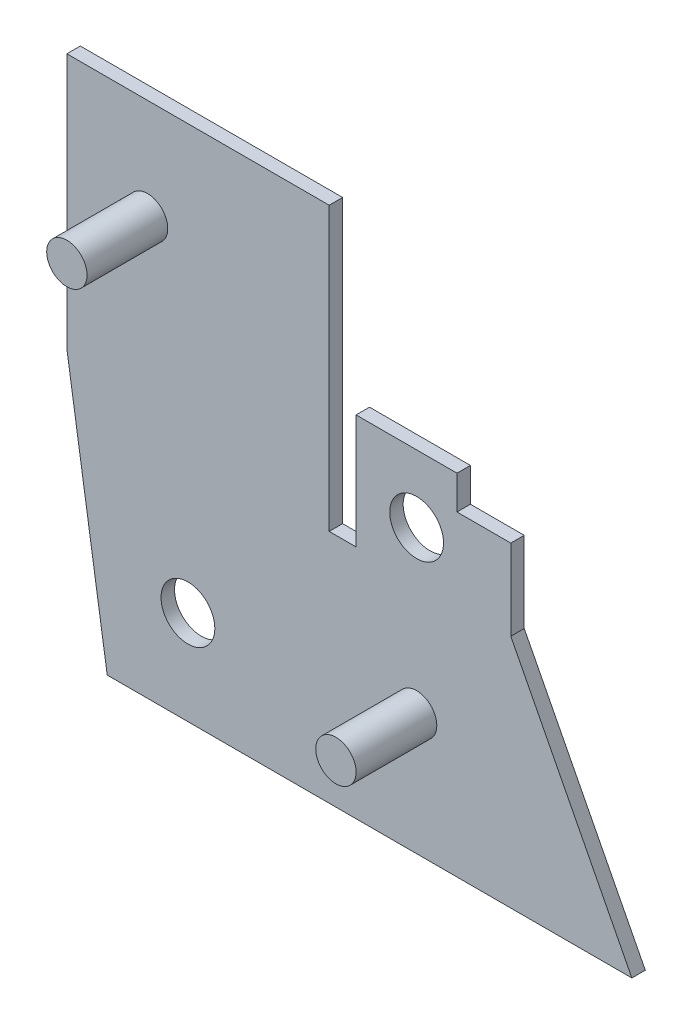
ISO-10303-21;
HEADER;
FILE_DESCRIPTION(('STEP AP214'),'2;1');
FILE_NAME('part.step','',(''),(''),'','','');
FILE_SCHEMA(('AUTOMOTIVE_DESIGN { 1 0 10303 214 1 1 1 1 }'));
ENDSEC;
DATA;
#1=APPLICATION_CONTEXT('core data for automotive mechanical design processes');
#2=APPLICATION_PROTOCOL_DEFINITION('international standard','automotive_design',2000,#1);
#3=PRODUCT_CONTEXT('',#1,'mechanical');
#4=PRODUCT('Part','Part','',(#3));
#5=PRODUCT_RELATED_PRODUCT_CATEGORY('part','',(#4));
#6=PRODUCT_DEFINITION_FORMATION('','',#4);
#7=PRODUCT_DEFINITION_CONTEXT('part definition',#1,'design');
#8=PRODUCT_DEFINITION('design','',#6,#7);
#9=PRODUCT_DEFINITION_SHAPE('','',#8);
#10=(LENGTH_UNIT() NAMED_UNIT(*) SI_UNIT(.MILLI.,.METRE.));
#11=(NAMED_UNIT(*) PLANE_ANGLE_UNIT() SI_UNIT($,.RADIAN.));
#12=(NAMED_UNIT(*) SI_UNIT($,.STERADIAN.) SOLID_ANGLE_UNIT());
#13=UNCERTAINTY_MEASURE_WITH_UNIT(LENGTH_MEASURE(1.E-05),#10,'distance_accuracy_value','');
#14=(GEOMETRIC_REPRESENTATION_CONTEXT(3) GLOBAL_UNCERTAINTY_ASSIGNED_CONTEXT((#13)) GLOBAL_UNIT_ASSIGNED_CONTEXT((#10,
#11,#12)) REPRESENTATION_CONTEXT('',''));
#15=CARTESIAN_POINT('',(0.,0.,0.));
#16=DIRECTION('',(0.,0.,1.));
#17=DIRECTION('',(1.,0.,0.));
#18=AXIS2_PLACEMENT_3D('',#15,#16,#17);
#19=CARTESIAN_POINT('',(30.,17.5,0.));
#20=DIRECTION('',(0.,1.,0.));
#21=DIRECTION('',(0.,0.,1.));
#22=AXIS2_PLACEMENT_3D('',#19,#20,#21);
#23=PLANE('',#22);
#24=DIRECTION('',(-1.,0.,0.));
#25=VECTOR('',#24,1.);
#26=CARTESIAN_POINT('',(30.,17.5,1.));
#27=LINE('',#26,#25);
#28=CARTESIAN_POINT('',(18.5,17.5,1.));
#29=VERTEX_POINT('',#28);
#30=CARTESIAN_POINT('',(16.5,17.5,1.));
#31=VERTEX_POINT('',#30);
#32=EDGE_CURVE('E186',#29,#31,#27,.T.);
#33=ORIENTED_EDGE('',*,*,#32,.F.);
#34=DIRECTION('',(0.,0.,1.));
#35=VECTOR('',#34,1.);
#36=CARTESIAN_POINT('',(18.5,17.5,1.));
#37=LINE('',#36,#35);
#38=CARTESIAN_POINT('',(18.5,17.5,0.));
#39=VERTEX_POINT('',#38);
#40=EDGE_CURVE('E157',#39,#29,#37,.T.);
#41=ORIENTED_EDGE('',*,*,#40,.F.);
#42=DIRECTION('',(-1.,0.,0.));
#43=VECTOR('',#42,1.);
#44=CARTESIAN_POINT('',(30.,17.5,0.));
#45=LINE('',#44,#43);
#46=CARTESIAN_POINT('',(16.5,17.5,0.));
#47=VERTEX_POINT('',#46);
#48=EDGE_CURVE('E169',#39,#47,#45,.T.);
#49=ORIENTED_EDGE('',*,*,#48,.T.);
#50=DIRECTION('',(0.,0.,1.));
#51=VECTOR('',#50,1.);
#52=CARTESIAN_POINT('',(16.5,17.5,0.));
#53=LINE('',#52,#51);
#54=EDGE_CURVE('E207',#47,#31,#53,.T.);
#55=ORIENTED_EDGE('',*,*,#54,.T.);
#56=EDGE_LOOP('',(#33,#41,#49,#55));
#57=FACE_BOUND('',#56,.T.);
#58=ADVANCED_FACE('F35',(#57),#23,.T.);
#59=CARTESIAN_POINT('',(0.,0.,0.));
#60=DIRECTION('',(0.,-1.,0.));
#61=DIRECTION('',(0.,0.,-1.));
#62=AXIS2_PLACEMENT_3D('',#59,#60,#61);
#63=PLANE('',#62);
#64=DIRECTION('',(1.,0.,0.));
#65=VECTOR('',#64,1.);
#66=CARTESIAN_POINT('',(0.,0.,1.));
#67=LINE('',#66,#65);
#68=CARTESIAN_POINT('',(0.,0.,1.));
#69=VERTEX_POINT('',#68);
#70=CARTESIAN_POINT('',(39.,0.,1.));
#71=VERTEX_POINT('',#70);
#72=EDGE_CURVE('E161',#69,#71,#67,.T.);
#73=ORIENTED_EDGE('',*,*,#72,.F.);
#74=DIRECTION('',(0.,0.,1.));
#75=VECTOR('',#74,1.);
#76=CARTESIAN_POINT('',(0.,0.,0.));
#77=LINE('',#76,#75);
#78=CARTESIAN_POINT('',(0.,0.,0.));
#79=VERTEX_POINT('',#78);
#80=EDGE_CURVE('E199',#79,#69,#77,.T.);
#81=ORIENTED_EDGE('',*,*,#80,.F.);
#82=DIRECTION('',(1.,0.,0.));
#83=VECTOR('',#82,1.);
#84=CARTESIAN_POINT('',(0.,0.,0.));
#85=LINE('',#84,#83);
#86=CARTESIAN_POINT('',(39.,0.,0.));
#87=VERTEX_POINT('',#86);
#88=EDGE_CURVE('E162',#79,#87,#85,.T.);
#89=ORIENTED_EDGE('',*,*,#88,.T.);
#90=DIRECTION('',(0.,0.,1.));
#91=VECTOR('',#90,1.);
#92=CARTESIAN_POINT('',(39.,0.,0.));
#93=LINE('',#92,#91);
#94=EDGE_CURVE('E183',#87,#71,#93,.T.);
#95=ORIENTED_EDGE('',*,*,#94,.T.);
#96=EDGE_LOOP('',(#73,#81,#89,#95));
#97=FACE_BOUND('',#96,.T.);
#98=ADVANCED_FACE('F37',(#97),#63,.T.);
#99=CARTESIAN_POINT('',(-3.,19.5,0.));
#100=DIRECTION('',(-0.988371697650617,-0.152057184253941,0.));
#101=DIRECTION('',(0.152057184253941,-0.988371697650617,0.));
#102=AXIS2_PLACEMENT_3D('',#99,#100,#101);
#103=PLANE('',#102);
#104=DIRECTION('',(0.152057184253941,-0.988371697650617,0.));
#105=VECTOR('',#104,1.);
#106=CARTESIAN_POINT('',(-3.,19.5,1.));
#107=LINE('',#106,#105);
#108=CARTESIAN_POINT('',(-3.,19.5,1.));
#109=VERTEX_POINT('',#108);
#110=EDGE_CURVE('E166',#109,#69,#107,.T.);
#111=ORIENTED_EDGE('',*,*,#110,.F.);
#112=DIRECTION('',(0.,0.,1.));
#113=VECTOR('',#112,1.);
#114=CARTESIAN_POINT('',(-3.,19.5,0.));
#115=LINE('',#114,#113);
#116=CARTESIAN_POINT('',(-3.,19.5,0.));
#117=VERTEX_POINT('',#116);
#118=EDGE_CURVE('E201',#117,#109,#115,.T.);
#119=ORIENTED_EDGE('',*,*,#118,.F.);
#120=DIRECTION('',(0.152057184253941,-0.988371697650617,0.));
#121=VECTOR('',#120,1.);
#122=CARTESIAN_POINT('',(-3.,19.5,0.));
#123=LINE('',#122,#121);
#124=EDGE_CURVE('E180',#117,#79,#123,.T.);
#125=ORIENTED_EDGE('',*,*,#124,.T.);
#126=ORIENTED_EDGE('',*,*,#80,.T.);
#127=EDGE_LOOP('',(#111,#119,#125,#126));
#128=FACE_BOUND('',#127,.T.);
#129=ADVANCED_FACE('F239',(#128),#103,.T.);
#130=CARTESIAN_POINT('',(-3.,38.5,0.));
#131=DIRECTION('',(-1.,0.,0.));
#132=DIRECTION('',(0.,-1.,0.));
#133=AXIS2_PLACEMENT_3D('',#130,#131,#132);
#134=PLANE('',#133);
#135=DIRECTION('',(0.,-1.,0.));
#136=VECTOR('',#135,1.);
#137=CARTESIAN_POINT('',(-3.,38.5,1.));
#138=LINE('',#137,#136);
#139=CARTESIAN_POINT('',(-3.,38.5,1.));
#140=VERTEX_POINT('',#139);
#141=EDGE_CURVE('E194',#140,#109,#138,.T.);
#142=ORIENTED_EDGE('',*,*,#141,.F.);
#143=DIRECTION('',(0.,0.,1.));
#144=VECTOR('',#143,1.);
#145=CARTESIAN_POINT('',(-3.,38.5,0.));
#146=LINE('',#145,#144);
#147=CARTESIAN_POINT('',(-3.,38.5,0.));
#148=VERTEX_POINT('',#147);
#149=EDGE_CURVE('E203',#148,#140,#146,.T.);
#150=ORIENTED_EDGE('',*,*,#149,.F.);
#151=DIRECTION('',(0.,-1.,0.));
#152=VECTOR('',#151,1.);
#153=CARTESIAN_POINT('',(-3.,38.5,0.));
#154=LINE('',#153,#152);
#155=EDGE_CURVE('E177',#148,#117,#154,.T.);
#156=ORIENTED_EDGE('',*,*,#155,.T.);
#157=ORIENTED_EDGE('',*,*,#118,.T.);
#158=EDGE_LOOP('',(#142,#150,#156,#157));
#159=FACE_BOUND('',#158,.T.);
#160=ADVANCED_FACE('F263',(#159),#134,.T.);
#161=CARTESIAN_POINT('',(16.5,38.5,0.));
#162=DIRECTION('',(0.,1.,0.));
#163=DIRECTION('',(0.,0.,1.));
#164=AXIS2_PLACEMENT_3D('',#161,#162,#163);
#165=PLANE('',#164);
#166=DIRECTION('',(-1.,0.,0.));
#167=VECTOR('',#166,1.);
#168=CARTESIAN_POINT('',(16.5,38.5,1.));
#169=LINE('',#168,#167);
#170=CARTESIAN_POINT('',(16.5,38.5,1.));
#171=VERTEX_POINT('',#170);
#172=EDGE_CURVE('E191',#171,#140,#169,.T.);
#173=ORIENTED_EDGE('',*,*,#172,.F.);
#174=DIRECTION('',(0.,0.,1.));
#175=VECTOR('',#174,1.);
#176=CARTESIAN_POINT('',(16.5,38.5,0.));
#177=LINE('',#176,#175);
#178=CARTESIAN_POINT('',(16.5,38.5,0.));
#179=VERTEX_POINT('',#178);
#180=EDGE_CURVE('E205',#179,#171,#177,.T.);
#181=ORIENTED_EDGE('',*,*,#180,.F.);
#182=DIRECTION('',(-1.,0.,0.));
#183=VECTOR('',#182,1.);
#184=CARTESIAN_POINT('',(16.5,38.5,0.));
#185=LINE('',#184,#183);
#186=EDGE_CURVE('E174',#179,#148,#185,.T.);
#187=ORIENTED_EDGE('',*,*,#186,.T.);
#188=ORIENTED_EDGE('',*,*,#149,.T.);
#189=EDGE_LOOP('',(#173,#181,#187,#188));
#190=FACE_BOUND('',#189,.T.);
#191=ADVANCED_FACE('F250',(#190),#165,.T.);
#192=CARTESIAN_POINT('',(16.5,17.5,0.));
#193=DIRECTION('',(1.,0.,0.));
#194=DIRECTION('',(0.,0.,-1.));
#195=AXIS2_PLACEMENT_3D('',#192,#193,#194);
#196=PLANE('',#195);
#197=DIRECTION('',(0.,1.,0.));
#198=VECTOR('',#197,1.);
#199=CARTESIAN_POINT('',(16.5,17.5,1.));
#200=LINE('',#199,#198);
#201=EDGE_CURVE('E188',#31,#171,#200,.T.);
#202=ORIENTED_EDGE('',*,*,#201,.F.);
#203=ORIENTED_EDGE('',*,*,#54,.F.);
#204=DIRECTION('',(0.,1.,0.));
#205=VECTOR('',#204,1.);
#206=CARTESIAN_POINT('',(16.5,17.5,0.));
#207=LINE('',#206,#205);
#208=EDGE_CURVE('E171',#47,#179,#207,.T.);
#209=ORIENTED_EDGE('',*,*,#208,.T.);
#210=ORIENTED_EDGE('',*,*,#180,.T.);
#211=EDGE_LOOP('',(#202,#203,#209,#210));
#212=FACE_BOUND('',#211,.T.);
#213=ADVANCED_FACE('F243',(#212),#196,.T.);
#214=CARTESIAN_POINT('',(39.,0.,0.));
#215=DIRECTION('',(0.889287802318147,0.457348012620761,0.));
#216=DIRECTION('',(-0.457348012620761,0.889287802318147,0.));
#217=AXIS2_PLACEMENT_3D('',#214,#215,#216);
#218=PLANE('',#217);
#219=DIRECTION('',(-0.457348012620761,0.889287802318147,0.));
#220=VECTOR('',#219,1.);
#221=CARTESIAN_POINT('',(39.,0.,1.));
#222=LINE('',#221,#220);
#223=CARTESIAN_POINT('',(30.,17.5,1.));
#224=VERTEX_POINT('',#223);
#225=EDGE_CURVE('E148',#71,#224,#222,.T.);
#226=ORIENTED_EDGE('',*,*,#225,.F.);
#227=ORIENTED_EDGE('',*,*,#94,.F.);
#228=DIRECTION('',(-0.457348012620761,0.889287802318147,0.));
#229=VECTOR('',#228,1.);
#230=CARTESIAN_POINT('',(39.,0.,0.));
#231=LINE('',#230,#229);
#232=CARTESIAN_POINT('',(30.,17.5,0.));
#233=VERTEX_POINT('',#232);
#234=EDGE_CURVE('E165',#87,#233,#231,.T.);
#235=ORIENTED_EDGE('',*,*,#234,.T.);
#236=DIRECTION('',(0.,0.,1.));
#237=VECTOR('',#236,1.);
#238=CARTESIAN_POINT('',(30.,17.5,0.));
#239=LINE('',#238,#237);
#240=EDGE_CURVE('E210',#233,#224,#239,.T.);
#241=ORIENTED_EDGE('',*,*,#240,.T.);
#242=EDGE_LOOP('',(#226,#227,#235,#241));
#243=FACE_BOUND('',#242,.T.);
#244=ADVANCED_FACE('F227',(#243),#218,.T.);
#245=CARTESIAN_POINT('',(0.,0.,0.));
#246=DIRECTION('',(0.,0.,1.));
#247=DIRECTION('',(1.,0.,0.));
#248=AXIS2_PLACEMENT_3D('',#245,#246,#247);
#249=PLANE('',#248);
#250=CARTESIAN_POINT('',(23.,21.,0.));
#251=DIRECTION('',(0.,0.,1.));
#252=DIRECTION('',(1.,0.,0.));
#253=AXIS2_PLACEMENT_3D('',#250,#251,#252);
#254=CIRCLE('',#253,1.99999999999999);
#255=CARTESIAN_POINT('',(25.,21.,0.));
#256=VERTEX_POINT('',#255);
#257=EDGE_CURVE('E302',#256,#256,#254,.T.);
#258=ORIENTED_EDGE('',*,*,#257,.T.);
#259=EDGE_LOOP('',(#258));
#260=FACE_BOUND('',#259,.T.);
#261=CARTESIAN_POINT('',(6.,7.,0.));
#262=DIRECTION('',(0.,0.,1.));
#263=DIRECTION('',(1.,0.,0.));
#264=AXIS2_PLACEMENT_3D('',#261,#262,#263);
#265=CIRCLE('',#264,1.99999999999999);
#266=CARTESIAN_POINT('',(7.99999999999999,7.,0.));
#267=VERTEX_POINT('',#266);
#268=EDGE_CURVE('E294',#267,#267,#265,.T.);
#269=ORIENTED_EDGE('',*,*,#268,.T.);
#270=EDGE_LOOP('',(#269));
#271=FACE_BOUND('',#270,.T.);
#272=DIRECTION('',(-1.,0.,0.));
#273=VECTOR('',#272,1.);
#274=CARTESIAN_POINT('',(18.5,26.,0.));
#275=LINE('',#274,#273);
#276=CARTESIAN_POINT('',(26.,26.,0.));
#277=VERTEX_POINT('',#276);
#278=CARTESIAN_POINT('',(18.5,26.,0.));
#279=VERTEX_POINT('',#278);
#280=EDGE_CURVE('E275',#277,#279,#275,.T.);
#281=ORIENTED_EDGE('',*,*,#280,.F.);
#282=DIRECTION('',(0.,1.,0.));
#283=VECTOR('',#282,1.);
#284=CARTESIAN_POINT('',(26.,23.5,0.));
#285=LINE('',#284,#283);
#286=CARTESIAN_POINT('',(26.,23.5,0.));
#287=VERTEX_POINT('',#286);
#288=EDGE_CURVE('E50',#287,#277,#285,.T.);
#289=ORIENTED_EDGE('',*,*,#288,.F.);
#290=DIRECTION('',(-1.,0.,0.));
#291=VECTOR('',#290,1.);
#292=CARTESIAN_POINT('',(30.,23.5,0.));
#293=LINE('',#292,#291);
#294=CARTESIAN_POINT('',(30.,23.5,0.));
#295=VERTEX_POINT('',#294);
#296=EDGE_CURVE('E287',#295,#287,#293,.T.);
#297=ORIENTED_EDGE('',*,*,#296,.F.);
#298=DIRECTION('',(0.,-1.,0.));
#299=VECTOR('',#298,1.);
#300=CARTESIAN_POINT('',(30.,26.,0.));
#301=LINE('',#300,#299);
#302=EDGE_CURVE('E142',#295,#233,#301,.T.);
#303=ORIENTED_EDGE('',*,*,#302,.T.);
#304=ORIENTED_EDGE('',*,*,#234,.F.);
#305=ORIENTED_EDGE('',*,*,#88,.F.);
#306=ORIENTED_EDGE('',*,*,#124,.F.);
#307=ORIENTED_EDGE('',*,*,#155,.F.);
#308=ORIENTED_EDGE('',*,*,#186,.F.);
#309=ORIENTED_EDGE('',*,*,#208,.F.);
#310=ORIENTED_EDGE('',*,*,#48,.F.);
#311=DIRECTION('',(0.,-1.,0.));
#312=VECTOR('',#311,1.);
#313=CARTESIAN_POINT('',(18.5,26.,0.));
#314=LINE('',#313,#312);
#315=EDGE_CURVE('E151',#279,#39,#314,.T.);
#316=ORIENTED_EDGE('',*,*,#315,.F.);
#317=EDGE_LOOP('',(#281,#289,#297,#303,#304,#305,#306,#307,#308,#309,#310,#316));
#318=FACE_BOUND('',#317,.T.);
#319=ADVANCED_FACE('F218',(#260,#271,#318),#249,.F.);
#320=CARTESIAN_POINT('',(0.,0.,1.));
#321=DIRECTION('',(0.,0.,1.));
#322=DIRECTION('',(1.,0.,0.));
#323=AXIS2_PLACEMENT_3D('',#320,#321,#322);
#324=PLANE('',#323);
#325=CARTESIAN_POINT('',(23.,21.,1.));
#326=DIRECTION('',(0.,0.,1.));
#327=DIRECTION('',(1.,0.,0.));
#328=AXIS2_PLACEMENT_3D('',#325,#326,#327);
#329=CIRCLE('',#328,1.99999999999999);
#330=CARTESIAN_POINT('',(25.,21.,1.));
#331=VERTEX_POINT('',#330);
#332=EDGE_CURVE('E305',#331,#331,#329,.T.);
#333=ORIENTED_EDGE('',*,*,#332,.F.);
#334=EDGE_LOOP('',(#333));
#335=FACE_BOUND('',#334,.T.);
#336=CARTESIAN_POINT('',(6.,7.,1.));
#337=DIRECTION('',(0.,0.,1.));
#338=DIRECTION('',(1.,0.,0.));
#339=AXIS2_PLACEMENT_3D('',#336,#337,#338);
#340=CIRCLE('',#339,1.99999999999999);
#341=CARTESIAN_POINT('',(7.99999999999999,7.,1.));
#342=VERTEX_POINT('',#341);
#343=EDGE_CURVE('E299',#342,#342,#340,.T.);
#344=ORIENTED_EDGE('',*,*,#343,.F.);
#345=EDGE_LOOP('',(#344));
#346=FACE_BOUND('',#345,.T.);
#347=CARTESIAN_POINT('',(23.,9.,1.));
#348=DIRECTION('',(0.,0.,1.));
#349=DIRECTION('',(1.,0.,0.));
#350=AXIS2_PLACEMENT_3D('',#347,#348,#349);
#351=CIRCLE('',#350,1.5);
#352=CARTESIAN_POINT('',(24.5,9.,1.));
#353=VERTEX_POINT('',#352);
#354=EDGE_CURVE('E11',#353,#353,#351,.T.);
#355=ORIENTED_EDGE('',*,*,#354,.F.);
#356=EDGE_LOOP('',(#355));
#357=FACE_BOUND('',#356,.T.);
#358=CARTESIAN_POINT('',(3.,31.,1.));
#359=DIRECTION('',(0.,0.,1.));
#360=DIRECTION('',(1.,0.,0.));
#361=AXIS2_PLACEMENT_3D('',#358,#359,#360);
#362=CIRCLE('',#361,1.5);
#363=CARTESIAN_POINT('',(4.5,31.,1.));
#364=VERTEX_POINT('',#363);
#365=EDGE_CURVE('E43',#364,#364,#362,.T.);
#366=ORIENTED_EDGE('',*,*,#365,.F.);
#367=EDGE_LOOP('',(#366));
#368=FACE_BOUND('',#367,.T.);
#369=DIRECTION('',(0.,1.,0.));
#370=VECTOR('',#369,1.);
#371=CARTESIAN_POINT('',(26.,23.5,1.));
#372=LINE('',#371,#370);
#373=CARTESIAN_POINT('',(26.,23.5,1.));
#374=VERTEX_POINT('',#373);
#375=CARTESIAN_POINT('',(26.,26.,1.));
#376=VERTEX_POINT('',#375);
#377=EDGE_CURVE('E134',#374,#376,#372,.T.);
#378=ORIENTED_EDGE('',*,*,#377,.T.);
#379=DIRECTION('',(1.,0.,0.));
#380=VECTOR('',#379,1.);
#381=CARTESIAN_POINT('',(30.,26.,1.));
#382=LINE('',#381,#380);
#383=CARTESIAN_POINT('',(18.5,26.,1.));
#384=VERTEX_POINT('',#383);
#385=EDGE_CURVE('E149',#384,#376,#382,.T.);
#386=ORIENTED_EDGE('',*,*,#385,.F.);
#387=DIRECTION('',(0.,-1.,0.));
#388=VECTOR('',#387,1.);
#389=CARTESIAN_POINT('',(18.5,26.,1.));
#390=LINE('',#389,#388);
#391=EDGE_CURVE('E58',#384,#29,#390,.T.);
#392=ORIENTED_EDGE('',*,*,#391,.T.);
#393=ORIENTED_EDGE('',*,*,#32,.T.);
#394=ORIENTED_EDGE('',*,*,#201,.T.);
#395=ORIENTED_EDGE('',*,*,#172,.T.);
#396=ORIENTED_EDGE('',*,*,#141,.T.);
#397=ORIENTED_EDGE('',*,*,#110,.T.);
#398=ORIENTED_EDGE('',*,*,#72,.T.);
#399=ORIENTED_EDGE('',*,*,#225,.T.);
#400=DIRECTION('',(0.,-1.,0.));
#401=VECTOR('',#400,1.);
#402=CARTESIAN_POINT('',(30.,26.,1.));
#403=LINE('',#402,#401);
#404=CARTESIAN_POINT('',(30.,23.5,1.));
#405=VERTEX_POINT('',#404);
#406=EDGE_CURVE('E140',#405,#224,#403,.T.);
#407=ORIENTED_EDGE('',*,*,#406,.F.);
#408=DIRECTION('',(-1.,0.,0.));
#409=VECTOR('',#408,1.);
#410=CARTESIAN_POINT('',(30.,23.5,1.));
#411=LINE('',#410,#409);
#412=EDGE_CURVE('E124',#405,#374,#411,.T.);
#413=ORIENTED_EDGE('',*,*,#412,.T.);
#414=EDGE_LOOP('',(#378,#386,#392,#393,#394,#395,#396,#397,#398,#399,#407,#413));
#415=FACE_BOUND('',#414,.T.);
#416=ADVANCED_FACE('F145',(#335,#346,#357,#368,#415),#324,.T.);
#417=CARTESIAN_POINT('',(30.,26.,0.));
#418=DIRECTION('',(-1.,0.,0.));
#419=DIRECTION('',(0.,0.,1.));
#420=AXIS2_PLACEMENT_3D('',#417,#418,#419);
#421=PLANE('',#420);
#422=ORIENTED_EDGE('',*,*,#302,.F.);
#423=DIRECTION('',(0.,0.,-1.));
#424=VECTOR('',#423,1.);
#425=CARTESIAN_POINT('',(30.,23.5,1.));
#426=LINE('',#425,#424);
#427=EDGE_CURVE('E128',#405,#295,#426,.T.);
#428=ORIENTED_EDGE('',*,*,#427,.F.);
#429=ORIENTED_EDGE('',*,*,#406,.T.);
#430=ORIENTED_EDGE('',*,*,#240,.F.);
#431=EDGE_LOOP('',(#422,#428,#429,#430));
#432=FACE_BOUND('',#431,.T.);
#433=ADVANCED_FACE('F138',(#432),#421,.F.);
#434=CARTESIAN_POINT('',(18.5,26.,1.));
#435=DIRECTION('',(1.,0.,0.));
#436=DIRECTION('',(0.,0.,-1.));
#437=AXIS2_PLACEMENT_3D('',#434,#435,#436);
#438=PLANE('',#437);
#439=ORIENTED_EDGE('',*,*,#40,.T.);
#440=ORIENTED_EDGE('',*,*,#391,.F.);
#441=DIRECTION('',(0.,0.,1.));
#442=VECTOR('',#441,1.);
#443=CARTESIAN_POINT('',(18.5,26.,1.));
#444=LINE('',#443,#442);
#445=EDGE_CURVE('E154',#279,#384,#444,.T.);
#446=ORIENTED_EDGE('',*,*,#445,.F.);
#447=ORIENTED_EDGE('',*,*,#315,.T.);
#448=EDGE_LOOP('',(#439,#440,#446,#447));
#449=FACE_BOUND('',#448,.T.);
#450=ADVANCED_FACE('F225',(#449),#438,.F.);
#451=CARTESIAN_POINT('',(0.,26.,0.));
#452=DIRECTION('',(0.,-1.,0.));
#453=DIRECTION('',(0.,0.,-1.));
#454=AXIS2_PLACEMENT_3D('',#451,#452,#453);
#455=PLANE('',#454);
#456=ORIENTED_EDGE('',*,*,#385,.T.);
#457=DIRECTION('',(0.,0.,-1.));
#458=VECTOR('',#457,1.);
#459=CARTESIAN_POINT('',(26.,26.,1.));
#460=LINE('',#459,#458);
#461=EDGE_CURVE('E276',#376,#277,#460,.T.);
#462=ORIENTED_EDGE('',*,*,#461,.T.);
#463=ORIENTED_EDGE('',*,*,#280,.T.);
#464=ORIENTED_EDGE('',*,*,#445,.T.);
#465=EDGE_LOOP('',(#456,#462,#463,#464));
#466=FACE_BOUND('',#465,.T.);
#467=ADVANCED_FACE('F284',(#466),#455,.F.);
#468=CARTESIAN_POINT('',(26.,23.5,1.));
#469=DIRECTION('',(-1.,0.,0.));
#470=DIRECTION('',(0.,0.,1.));
#471=AXIS2_PLACEMENT_3D('',#468,#469,#470);
#472=PLANE('',#471);
#473=ORIENTED_EDGE('',*,*,#288,.T.);
#474=ORIENTED_EDGE('',*,*,#461,.F.);
#475=ORIENTED_EDGE('',*,*,#377,.F.);
#476=DIRECTION('',(0.,0.,-1.));
#477=VECTOR('',#476,1.);
#478=CARTESIAN_POINT('',(26.,23.5,1.));
#479=LINE('',#478,#477);
#480=EDGE_CURVE('E130',#374,#287,#479,.T.);
#481=ORIENTED_EDGE('',*,*,#480,.T.);
#482=EDGE_LOOP('',(#473,#474,#475,#481));
#483=FACE_BOUND('',#482,.T.);
#484=ADVANCED_FACE('F334',(#483),#472,.F.);
#485=CARTESIAN_POINT('',(30.,23.5,1.));
#486=DIRECTION('',(0.,-1.,0.));
#487=DIRECTION('',(0.,0.,-1.));
#488=AXIS2_PLACEMENT_3D('',#485,#486,#487);
#489=PLANE('',#488);
#490=ORIENTED_EDGE('',*,*,#296,.T.);
#491=ORIENTED_EDGE('',*,*,#480,.F.);
#492=ORIENTED_EDGE('',*,*,#412,.F.);
#493=ORIENTED_EDGE('',*,*,#427,.T.);
#494=EDGE_LOOP('',(#490,#491,#492,#493));
#495=FACE_BOUND('',#494,.T.);
#496=ADVANCED_FACE('F127',(#495),#489,.F.);
#497=CARTESIAN_POINT('',(3.,31.,7.));
#498=DIRECTION('',(0.,0.,-1.));
#499=DIRECTION('',(-1.,0.,0.));
#500=AXIS2_PLACEMENT_3D('',#497,#498,#499);
#501=CYLINDRICAL_SURFACE('',#500,1.5);
#502=CARTESIAN_POINT('',(3.,31.,7.));
#503=DIRECTION('',(0.,0.,-1.));
#504=DIRECTION('',(-1.,0.,0.));
#505=AXIS2_PLACEMENT_3D('',#502,#503,#504);
#506=CIRCLE('',#505,1.5);
#507=CARTESIAN_POINT('',(1.5,31.,7.));
#508=VERTEX_POINT('',#507);
#509=EDGE_CURVE('E288',#508,#508,#506,.T.);
#510=ORIENTED_EDGE('',*,*,#509,.T.);
#511=EDGE_LOOP('',(#510));
#512=FACE_BOUND('',#511,.T.);
#513=ORIENTED_EDGE('',*,*,#365,.T.);
#514=EDGE_LOOP('',(#513));
#515=FACE_BOUND('',#514,.T.);
#516=ADVANCED_FACE('F215',(#512,#515),#501,.T.);
#517=CARTESIAN_POINT('',(4.5,31.,7.));
#518=DIRECTION('',(0.,0.,1.));
#519=DIRECTION('',(1.,0.,0.));
#520=AXIS2_PLACEMENT_3D('',#517,#518,#519);
#521=PLANE('',#520);
#522=ORIENTED_EDGE('',*,*,#509,.F.);
#523=EDGE_LOOP('',(#522));
#524=FACE_BOUND('',#523,.T.);
#525=ADVANCED_FACE('F327',(#524),#521,.T.);
#526=CARTESIAN_POINT('',(23.,9.,7.));
#527=DIRECTION('',(0.,0.,-1.));
#528=DIRECTION('',(-1.,0.,0.));
#529=AXIS2_PLACEMENT_3D('',#526,#527,#528);
#530=CYLINDRICAL_SURFACE('',#529,1.5);
#531=CARTESIAN_POINT('',(23.,9.,7.));
#532=DIRECTION('',(0.,0.,-1.));
#533=DIRECTION('',(-1.,0.,0.));
#534=AXIS2_PLACEMENT_3D('',#531,#532,#533);
#535=CIRCLE('',#534,1.5);
#536=CARTESIAN_POINT('',(21.5,9.,7.));
#537=VERTEX_POINT('',#536);
#538=EDGE_CURVE('E290',#537,#537,#535,.T.);
#539=ORIENTED_EDGE('',*,*,#538,.T.);
#540=EDGE_LOOP('',(#539));
#541=FACE_BOUND('',#540,.T.);
#542=ORIENTED_EDGE('',*,*,#354,.T.);
#543=EDGE_LOOP('',(#542));
#544=FACE_BOUND('',#543,.T.);
#545=ADVANCED_FACE('F323',(#541,#544),#530,.T.);
#546=CARTESIAN_POINT('',(24.5,9.,7.));
#547=DIRECTION('',(0.,0.,1.));
#548=DIRECTION('',(1.,0.,0.));
#549=AXIS2_PLACEMENT_3D('',#546,#547,#548);
#550=PLANE('',#549);
#551=ORIENTED_EDGE('',*,*,#538,.F.);
#552=EDGE_LOOP('',(#551));
#553=FACE_BOUND('',#552,.T.);
#554=ADVANCED_FACE('F316',(#553),#550,.T.);
#555=CARTESIAN_POINT('',(6.,7.,1.));
#556=DIRECTION('',(0.,0.,1.));
#557=DIRECTION('',(1.,0.,0.));
#558=AXIS2_PLACEMENT_3D('',#555,#556,#557);
#559=CYLINDRICAL_SURFACE('',#558,1.99999999999999);
#560=ORIENTED_EDGE('',*,*,#268,.F.);
#561=EDGE_LOOP('',(#560));
#562=FACE_BOUND('',#561,.T.);
#563=ORIENTED_EDGE('',*,*,#343,.T.);
#564=EDGE_LOOP('',(#563));
#565=FACE_BOUND('',#564,.T.);
#566=ADVANCED_FACE('F310',(#562,#565),#559,.F.);
#567=CARTESIAN_POINT('',(23.,21.,1.));
#568=DIRECTION('',(0.,0.,1.));
#569=DIRECTION('',(1.,0.,0.));
#570=AXIS2_PLACEMENT_3D('',#567,#568,#569);
#571=CYLINDRICAL_SURFACE('',#570,1.99999999999999);
#572=ORIENTED_EDGE('',*,*,#257,.F.);
#573=EDGE_LOOP('',(#572));
#574=FACE_BOUND('',#573,.T.);
#575=ORIENTED_EDGE('',*,*,#332,.T.);
#576=EDGE_LOOP('',(#575));
#577=FACE_BOUND('',#576,.T.);
#578=ADVANCED_FACE('F308',(#574,#577),#571,.F.);
#579=CLOSED_SHELL('',(#58,#98,#129,#160,#191,#213,#244,#319,#416,#433,#450,#467,#484,#496,#516,
#525,#545,#554,#566,#578));
#580=MANIFOLD_SOLID_BREP('B2',#579);
#581=ADVANCED_BREP_SHAPE_REPRESENTATION('',(#18,#580),#14);
#582=SHAPE_DEFINITION_REPRESENTATION(#9,#581);
ENDSEC;
END-ISO-10303-21;
